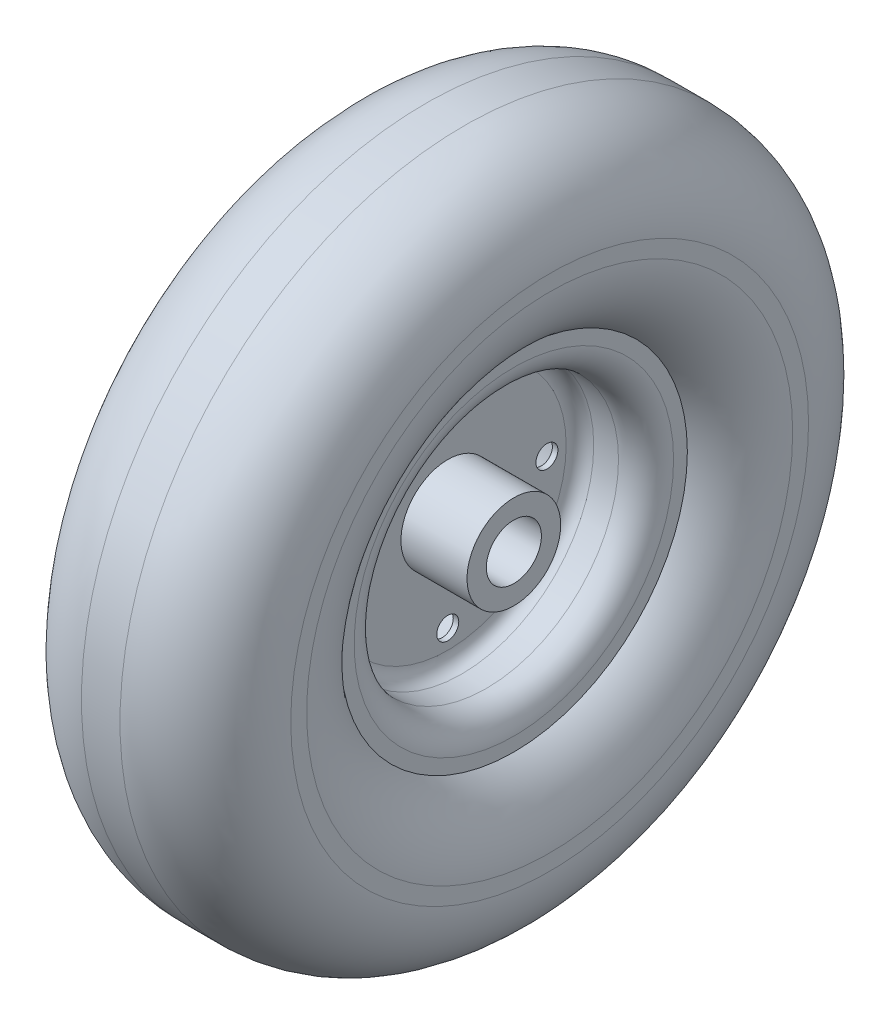
ISO-10303-21;
HEADER;
FILE_DESCRIPTION(('STEP AP214'),'2;1');
FILE_NAME('part.step','',(''),(''),'','','');
FILE_SCHEMA(('AUTOMOTIVE_DESIGN { 1 0 10303 214 1 1 1 1 }'));
ENDSEC;
DATA;
#1=APPLICATION_CONTEXT('core data for automotive mechanical design processes');
#2=APPLICATION_PROTOCOL_DEFINITION('international standard','automotive_design',2000,#1);
#3=PRODUCT_CONTEXT('',#1,'mechanical');
#4=PRODUCT('Part','Part','',(#3));
#5=PRODUCT_RELATED_PRODUCT_CATEGORY('part','',(#4));
#6=PRODUCT_DEFINITION_FORMATION('','',#4);
#7=PRODUCT_DEFINITION_CONTEXT('part definition',#1,'design');
#8=PRODUCT_DEFINITION('design','',#6,#7);
#9=PRODUCT_DEFINITION_SHAPE('','',#8);
#10=(LENGTH_UNIT() NAMED_UNIT(*) SI_UNIT(.MILLI.,.METRE.));
#11=(NAMED_UNIT(*) PLANE_ANGLE_UNIT() SI_UNIT($,.RADIAN.));
#12=(NAMED_UNIT(*) SI_UNIT($,.STERADIAN.) SOLID_ANGLE_UNIT());
#13=UNCERTAINTY_MEASURE_WITH_UNIT(LENGTH_MEASURE(1.E-05),#10,'distance_accuracy_value','');
#14=(GEOMETRIC_REPRESENTATION_CONTEXT(3) GLOBAL_UNCERTAINTY_ASSIGNED_CONTEXT((#13)) GLOBAL_UNIT_ASSIGNED_CONTEXT((#10,
#11,#12)) REPRESENTATION_CONTEXT('',''));
#15=CARTESIAN_POINT('',(0.,0.,0.));
#16=DIRECTION('',(0.,0.,1.));
#17=DIRECTION('',(1.,0.,0.));
#18=AXIS2_PLACEMENT_3D('',#15,#16,#17);
#19=CARTESIAN_POINT('',(76.,0.,0.));
#20=DIRECTION('',(-1.,0.,0.));
#21=DIRECTION('',(0.,0.,1.));
#22=AXIS2_PLACEMENT_3D('',#19,#20,#21);
#23=CYLINDRICAL_SURFACE('',#22,10.);
#24=CARTESIAN_POINT('',(13.,0.,0.));
#25=DIRECTION('',(-1.,0.,0.));
#26=DIRECTION('',(0.,0.,1.));
#27=AXIS2_PLACEMENT_3D('',#24,#25,#26);
#28=CIRCLE('',#27,10.);
#29=CARTESIAN_POINT('',(13.,0.,10.));
#30=VERTEX_POINT('',#29);
#31=EDGE_CURVE('E89',#30,#30,#28,.T.);
#32=ORIENTED_EDGE('',*,*,#31,.T.);
#33=EDGE_LOOP('',(#32));
#34=FACE_BOUND('',#33,.T.);
#35=CARTESIAN_POINT('',(63.,0.,0.));
#36=DIRECTION('',(1.,0.,0.));
#37=DIRECTION('',(0.,0.,-1.));
#38=AXIS2_PLACEMENT_3D('',#35,#36,#37);
#39=CIRCLE('',#38,10.);
#40=CARTESIAN_POINT('',(63.,0.,-10.));
#41=VERTEX_POINT('',#40);
#42=EDGE_CURVE('E84',#41,#41,#39,.T.);
#43=ORIENTED_EDGE('',*,*,#42,.T.);
#44=EDGE_LOOP('',(#43));
#45=FACE_BOUND('',#44,.T.);
#46=ADVANCED_FACE('F30',(#34,#45),#23,.F.);
#47=CARTESIAN_POINT('',(76.,0.,0.));
#48=DIRECTION('',(1.,0.,0.));
#49=DIRECTION('',(0.,0.,-1.));
#50=AXIS2_PLACEMENT_3D('',#47,#48,#49);
#51=PLANE('',#50);
#52=CARTESIAN_POINT('',(76.,0.,0.));
#53=DIRECTION('',(1.,0.,0.));
#54=DIRECTION('',(0.,0.,-1.));
#55=AXIS2_PLACEMENT_3D('',#52,#53,#54);
#56=CIRCLE('',#55,88.2388589282479);
#57=CARTESIAN_POINT('',(76.,0.,-88.2388589282479));
#58=VERTEX_POINT('',#57);
#59=EDGE_CURVE('E74',#58,#58,#56,.F.);
#60=ORIENTED_EDGE('',*,*,#59,.T.);
#61=EDGE_LOOP('',(#60));
#62=FACE_BOUND('',#61,.T.);
#63=CARTESIAN_POINT('',(76.,0.,0.));
#64=DIRECTION('',(1.,0.,0.));
#65=DIRECTION('',(0.,0.,-1.));
#66=AXIS2_PLACEMENT_3D('',#63,#64,#65);
#67=CIRCLE('',#66,94.);
#68=CARTESIAN_POINT('',(76.,0.,-94.));
#69=VERTEX_POINT('',#68);
#70=EDGE_CURVE('E77',#69,#69,#67,.T.);
#71=ORIENTED_EDGE('',*,*,#70,.T.);
#72=EDGE_LOOP('',(#71));
#73=FACE_BOUND('',#72,.T.);
#74=ADVANCED_FACE('F170',(#62,#73),#51,.T.);
#75=CARTESIAN_POINT('',(0.,0.,0.));
#76=DIRECTION('',(1.,0.,0.));
#77=DIRECTION('',(0.,0.,-1.));
#78=AXIS2_PLACEMENT_3D('',#75,#76,#77);
#79=PLANE('',#78);
#80=CARTESIAN_POINT('',(0.,0.,0.));
#81=DIRECTION('',(1.,0.,0.));
#82=DIRECTION('',(0.,0.,-1.));
#83=AXIS2_PLACEMENT_3D('',#80,#81,#82);
#84=CIRCLE('',#83,88.2388589282479);
#85=CARTESIAN_POINT('',(0.,0.,-88.2388589282479));
#86=VERTEX_POINT('',#85);
#87=EDGE_CURVE('E65',#86,#86,#84,.T.);
#88=ORIENTED_EDGE('',*,*,#87,.T.);
#89=EDGE_LOOP('',(#88));
#90=FACE_BOUND('',#89,.T.);
#91=CARTESIAN_POINT('',(0.,0.,0.));
#92=DIRECTION('',(1.,0.,0.));
#93=DIRECTION('',(0.,0.,-1.));
#94=AXIS2_PLACEMENT_3D('',#91,#92,#93);
#95=CIRCLE('',#94,94.);
#96=CARTESIAN_POINT('',(0.,0.,-94.));
#97=VERTEX_POINT('',#96);
#98=EDGE_CURVE('E68',#97,#97,#95,.F.);
#99=ORIENTED_EDGE('',*,*,#98,.T.);
#100=EDGE_LOOP('',(#99));
#101=FACE_BOUND('',#100,.T.);
#102=ADVANCED_FACE('F176',(#90,#101),#79,.F.);
#103=CARTESIAN_POINT('',(76.,0.,0.));
#104=DIRECTION('',(-1.,0.,0.));
#105=DIRECTION('',(0.,0.,1.));
#106=AXIS2_PLACEMENT_3D('',#103,#104,#105);
#107=CYLINDRICAL_SURFACE('',#106,125.);
#108=CARTESIAN_POINT('',(31.,0.,0.));
#109=DIRECTION('',(1.,0.,0.));
#110=DIRECTION('',(0.,0.,-1.));
#111=AXIS2_PLACEMENT_3D('',#108,#109,#110);
#112=CIRCLE('',#111,125.);
#113=CARTESIAN_POINT('',(31.,0.,-125.));
#114=VERTEX_POINT('',#113);
#115=EDGE_CURVE('E62',#114,#114,#112,.T.);
#116=ORIENTED_EDGE('',*,*,#115,.T.);
#117=EDGE_LOOP('',(#116));
#118=FACE_BOUND('',#117,.T.);
#119=CARTESIAN_POINT('',(45.,0.,0.));
#120=DIRECTION('',(1.,0.,0.));
#121=DIRECTION('',(0.,0.,-1.));
#122=AXIS2_PLACEMENT_3D('',#119,#120,#121);
#123=CIRCLE('',#122,125.);
#124=CARTESIAN_POINT('',(45.,0.,-125.));
#125=VERTEX_POINT('',#124);
#126=EDGE_CURVE('E71',#125,#125,#123,.F.);
#127=ORIENTED_EDGE('',*,*,#126,.T.);
#128=EDGE_LOOP('',(#127));
#129=FACE_BOUND('',#128,.T.);
#130=ADVANCED_FACE('F184',(#118,#129),#107,.T.);
#131=CARTESIAN_POINT('',(13.,0.,0.));
#132=DIRECTION('',(-1.,0.,0.));
#133=DIRECTION('',(0.,0.,1.));
#134=AXIS2_PLACEMENT_3D('',#131,#132,#133);
#135=PLANE('',#134);
#136=ORIENTED_EDGE('',*,*,#31,.F.);
#137=EDGE_LOOP('',(#136));
#138=FACE_BOUND('',#137,.T.);
#139=CARTESIAN_POINT('',(13.,0.,0.));
#140=DIRECTION('',(-1.,0.,0.));
#141=DIRECTION('',(0.,0.,1.));
#142=AXIS2_PLACEMENT_3D('',#139,#140,#141);
#143=CIRCLE('',#142,17.);
#144=CARTESIAN_POINT('',(13.,0.,17.));
#145=VERTEX_POINT('',#144);
#146=EDGE_CURVE('E86',#145,#145,#143,.F.);
#147=ORIENTED_EDGE('',*,*,#146,.F.);
#148=EDGE_LOOP('',(#147));
#149=FACE_BOUND('',#148,.T.);
#150=ADVANCED_FACE('F188',(#138,#149),#135,.T.);
#151=CARTESIAN_POINT('',(13.,0.,0.));
#152=DIRECTION('',(-1.,0.,0.));
#153=DIRECTION('',(0.,0.,1.));
#154=AXIS2_PLACEMENT_3D('',#151,#152,#153);
#155=CIRCLE('',#154,58.);
#156=CARTESIAN_POINT('',(13.,0.,58.));
#157=VERTEX_POINT('',#156);
#158=EDGE_CURVE('E59',#157,#157,#155,.F.);
#159=ORIENTED_EDGE('',*,*,#158,.T.);
#160=EDGE_LOOP('',(#159));
#161=FACE_BOUND('',#160,.T.);
#162=CARTESIAN_POINT('',(13.,0.,0.));
#163=DIRECTION('',(-1.,0.,0.));
#164=DIRECTION('',(0.,0.,1.));
#165=AXIS2_PLACEMENT_3D('',#162,#163,#164);
#166=CIRCLE('',#165,63.);
#167=CARTESIAN_POINT('',(13.,0.,63.));
#168=VERTEX_POINT('',#167);
#169=EDGE_CURVE('E90',#168,#168,#166,.T.);
#170=ORIENTED_EDGE('',*,*,#169,.T.);
#171=EDGE_LOOP('',(#170));
#172=FACE_BOUND('',#171,.T.);
#173=ADVANCED_FACE('F312',(#161,#172),#135,.T.);
#174=CARTESIAN_POINT('',(37.,0.,0.));
#175=DIRECTION('',(-1.,0.,0.));
#176=DIRECTION('',(0.,0.,1.));
#177=AXIS2_PLACEMENT_3D('',#174,#175,#176);
#178=CYLINDRICAL_SURFACE('',#177,48.);
#179=CARTESIAN_POINT('',(32.,0.,0.));
#180=DIRECTION('',(-1.,0.,0.));
#181=DIRECTION('',(0.,0.,1.));
#182=AXIS2_PLACEMENT_3D('',#179,#180,#181);
#183=CIRCLE('',#182,48.);
#184=CARTESIAN_POINT('',(32.,0.,48.));
#185=VERTEX_POINT('',#184);
#186=EDGE_CURVE('E10',#185,#185,#183,.F.);
#187=ORIENTED_EDGE('',*,*,#186,.T.);
#188=EDGE_LOOP('',(#187));
#189=FACE_BOUND('',#188,.T.);
#190=CARTESIAN_POINT('',(23.,0.,0.));
#191=DIRECTION('',(-1.,0.,0.));
#192=DIRECTION('',(0.,0.,1.));
#193=AXIS2_PLACEMENT_3D('',#190,#191,#192);
#194=CIRCLE('',#193,48.);
#195=CARTESIAN_POINT('',(23.,0.,48.));
#196=VERTEX_POINT('',#195);
#197=EDGE_CURVE('E56',#196,#196,#194,.T.);
#198=ORIENTED_EDGE('',*,*,#197,.T.);
#199=EDGE_LOOP('',(#198));
#200=FACE_BOUND('',#199,.T.);
#201=ADVANCED_FACE('F308',(#189,#200),#178,.F.);
#202=CARTESIAN_POINT('',(37.,0.,0.));
#203=DIRECTION('',(-1.,0.,0.));
#204=DIRECTION('',(0.,0.,1.));
#205=AXIS2_PLACEMENT_3D('',#202,#203,#204);
#206=PLANE('',#205);
#207=CARTESIAN_POINT('',(37.,0.,0.));
#208=DIRECTION('',(-1.,0.,0.));
#209=DIRECTION('',(0.,0.,1.));
#210=AXIS2_PLACEMENT_3D('',#207,#208,#209);
#211=CIRCLE('',#210,43.);
#212=CARTESIAN_POINT('',(37.,0.,43.));
#213=VERTEX_POINT('',#212);
#214=EDGE_CURVE('E37',#213,#213,#211,.T.);
#215=ORIENTED_EDGE('',*,*,#214,.T.);
#216=EDGE_LOOP('',(#215));
#217=FACE_BOUND('',#216,.T.);
#218=CARTESIAN_POINT('',(37.,-1.0231817578993E-12,35.999999999999));
#219=DIRECTION('',(-1.,0.,0.));
#220=DIRECTION('',(0.,0.,1.));
#221=AXIS2_PLACEMENT_3D('',#218,#219,#220);
#222=CIRCLE('',#221,4.00000000000164);
#223=CARTESIAN_POINT('',(37.,-1.0231817578993E-12,40.0000000000006));
#224=VERTEX_POINT('',#223);
#225=EDGE_CURVE('E122',#224,#224,#222,.T.);
#226=ORIENTED_EDGE('',*,*,#225,.F.);
#227=EDGE_LOOP('',(#226));
#228=FACE_BOUND('',#227,.T.);
#229=CARTESIAN_POINT('',(37.,-36.,-2.03754605884474E-12));
#230=DIRECTION('',(-1.,0.,0.));
#231=DIRECTION('',(0.,0.,1.));
#232=AXIS2_PLACEMENT_3D('',#229,#230,#231);
#233=CIRCLE('',#232,4.00000000000219);
#234=CARTESIAN_POINT('',(37.,-36.,4.00000000000015));
#235=VERTEX_POINT('',#234);
#236=EDGE_CURVE('E116',#235,#235,#233,.T.);
#237=ORIENTED_EDGE('',*,*,#236,.F.);
#238=EDGE_LOOP('',(#237));
#239=FACE_BOUND('',#238,.T.);
#240=CARTESIAN_POINT('',(37.,1.01877302942237E-12,-36.000000000001));
#241=DIRECTION('',(-1.,0.,0.));
#242=DIRECTION('',(0.,0.,1.));
#243=AXIS2_PLACEMENT_3D('',#240,#241,#242);
#244=CIRCLE('',#243,4.0000000000008);
#245=CARTESIAN_POINT('',(37.,1.01877302942237E-12,-32.0000000000002));
#246=VERTEX_POINT('',#245);
#247=EDGE_CURVE('E110',#246,#246,#244,.T.);
#248=ORIENTED_EDGE('',*,*,#247,.F.);
#249=EDGE_LOOP('',(#248));
#250=FACE_BOUND('',#249,.T.);
#251=CARTESIAN_POINT('',(37.,36.,0.));
#252=DIRECTION('',(-1.,0.,0.));
#253=DIRECTION('',(0.,0.,1.));
#254=AXIS2_PLACEMENT_3D('',#251,#252,#253);
#255=CIRCLE('',#254,4.);
#256=CARTESIAN_POINT('',(37.,36.,4.));
#257=VERTEX_POINT('',#256);
#258=EDGE_CURVE('E104',#257,#257,#255,.T.);
#259=ORIENTED_EDGE('',*,*,#258,.F.);
#260=EDGE_LOOP('',(#259));
#261=FACE_BOUND('',#260,.T.);
#262=CARTESIAN_POINT('',(37.,0.,0.));
#263=DIRECTION('',(-1.,0.,0.));
#264=DIRECTION('',(0.,0.,1.));
#265=AXIS2_PLACEMENT_3D('',#262,#263,#264);
#266=CIRCLE('',#265,17.);
#267=CARTESIAN_POINT('',(37.,0.,17.));
#268=VERTEX_POINT('',#267);
#269=EDGE_CURVE('E93',#268,#268,#266,.T.);
#270=ORIENTED_EDGE('',*,*,#269,.F.);
#271=EDGE_LOOP('',(#270));
#272=FACE_BOUND('',#271,.T.);
#273=ADVANCED_FACE('F163',(#217,#228,#239,#250,#261,#272),#206,.T.);
#274=CARTESIAN_POINT('',(37.,0.,0.));
#275=DIRECTION('',(-1.,0.,0.));
#276=DIRECTION('',(0.,0.,1.));
#277=AXIS2_PLACEMENT_3D('',#274,#275,#276);
#278=CYLINDRICAL_SURFACE('',#277,17.);
#279=ORIENTED_EDGE('',*,*,#269,.T.);
#280=EDGE_LOOP('',(#279));
#281=FACE_BOUND('',#280,.T.);
#282=ORIENTED_EDGE('',*,*,#146,.T.);
#283=EDGE_LOOP('',(#282));
#284=FACE_BOUND('',#283,.T.);
#285=ADVANCED_FACE('F155',(#281,#284),#278,.T.);
#286=CARTESIAN_POINT('',(63.,0.,0.));
#287=DIRECTION('',(1.,0.,0.));
#288=DIRECTION('',(0.,0.,-1.));
#289=AXIS2_PLACEMENT_3D('',#286,#287,#288);
#290=PLANE('',#289);
#291=ORIENTED_EDGE('',*,*,#42,.F.);
#292=EDGE_LOOP('',(#291));
#293=FACE_BOUND('',#292,.T.);
#294=CARTESIAN_POINT('',(63.,0.,0.));
#295=DIRECTION('',(1.,0.,0.));
#296=DIRECTION('',(0.,0.,-1.));
#297=AXIS2_PLACEMENT_3D('',#294,#295,#296);
#298=CIRCLE('',#297,17.);
#299=CARTESIAN_POINT('',(63.,0.,-17.));
#300=VERTEX_POINT('',#299);
#301=EDGE_CURVE('E81',#300,#300,#298,.F.);
#302=ORIENTED_EDGE('',*,*,#301,.F.);
#303=EDGE_LOOP('',(#302));
#304=FACE_BOUND('',#303,.T.);
#305=ADVANCED_FACE('F152',(#293,#304),#290,.T.);
#306=CARTESIAN_POINT('',(63.,0.,0.));
#307=DIRECTION('',(1.,0.,0.));
#308=DIRECTION('',(0.,0.,-1.));
#309=AXIS2_PLACEMENT_3D('',#306,#307,#308);
#310=CIRCLE('',#309,58.);
#311=CARTESIAN_POINT('',(63.,0.,-58.));
#312=VERTEX_POINT('',#311);
#313=EDGE_CURVE('E53',#312,#312,#310,.F.);
#314=ORIENTED_EDGE('',*,*,#313,.T.);
#315=EDGE_LOOP('',(#314));
#316=FACE_BOUND('',#315,.T.);
#317=CARTESIAN_POINT('',(63.,0.,0.));
#318=DIRECTION('',(1.,0.,0.));
#319=DIRECTION('',(0.,0.,-1.));
#320=AXIS2_PLACEMENT_3D('',#317,#318,#319);
#321=CIRCLE('',#320,63.);
#322=CARTESIAN_POINT('',(63.,0.,-63.));
#323=VERTEX_POINT('',#322);
#324=EDGE_CURVE('E85',#323,#323,#321,.T.);
#325=ORIENTED_EDGE('',*,*,#324,.T.);
#326=EDGE_LOOP('',(#325));
#327=FACE_BOUND('',#326,.T.);
#328=ADVANCED_FACE('F154',(#316,#327),#290,.T.);
#329=CARTESIAN_POINT('',(39.,0.,0.));
#330=DIRECTION('',(1.,0.,0.));
#331=DIRECTION('',(0.,0.,-1.));
#332=AXIS2_PLACEMENT_3D('',#329,#330,#331);
#333=CYLINDRICAL_SURFACE('',#332,48.);
#334=CARTESIAN_POINT('',(44.,0.,0.));
#335=DIRECTION('',(1.,0.,0.));
#336=DIRECTION('',(0.,0.,-1.));
#337=AXIS2_PLACEMENT_3D('',#334,#335,#336);
#338=CIRCLE('',#337,48.);
#339=CARTESIAN_POINT('',(44.,0.,-48.));
#340=VERTEX_POINT('',#339);
#341=EDGE_CURVE('E41',#340,#340,#338,.F.);
#342=ORIENTED_EDGE('',*,*,#341,.T.);
#343=EDGE_LOOP('',(#342));
#344=FACE_BOUND('',#343,.T.);
#345=CARTESIAN_POINT('',(53.,0.,0.));
#346=DIRECTION('',(1.,0.,0.));
#347=DIRECTION('',(0.,0.,-1.));
#348=AXIS2_PLACEMENT_3D('',#345,#346,#347);
#349=CIRCLE('',#348,48.);
#350=CARTESIAN_POINT('',(53.,0.,-48.));
#351=VERTEX_POINT('',#350);
#352=EDGE_CURVE('E50',#351,#351,#349,.T.);
#353=ORIENTED_EDGE('',*,*,#352,.T.);
#354=EDGE_LOOP('',(#353));
#355=FACE_BOUND('',#354,.T.);
#356=ADVANCED_FACE('F135',(#344,#355),#333,.F.);
#357=CARTESIAN_POINT('',(39.,0.,0.));
#358=DIRECTION('',(1.,0.,0.));
#359=DIRECTION('',(0.,0.,-1.));
#360=AXIS2_PLACEMENT_3D('',#357,#358,#359);
#361=PLANE('',#360);
#362=CARTESIAN_POINT('',(39.,0.,0.));
#363=DIRECTION('',(1.,0.,0.));
#364=DIRECTION('',(0.,0.,-1.));
#365=AXIS2_PLACEMENT_3D('',#362,#363,#364);
#366=CIRCLE('',#365,43.);
#367=CARTESIAN_POINT('',(39.,0.,-43.));
#368=VERTEX_POINT('',#367);
#369=EDGE_CURVE('E45',#368,#368,#366,.T.);
#370=ORIENTED_EDGE('',*,*,#369,.T.);
#371=EDGE_LOOP('',(#370));
#372=FACE_BOUND('',#371,.T.);
#373=CARTESIAN_POINT('',(39.,-1.0231817578993E-12,35.999999999999));
#374=DIRECTION('',(1.,0.,0.));
#375=DIRECTION('',(0.,0.,-1.));
#376=AXIS2_PLACEMENT_3D('',#373,#374,#375);
#377=CIRCLE('',#376,4.00000000000164);
#378=CARTESIAN_POINT('',(39.,-1.0231817578993E-12,31.9999999999973));
#379=VERTEX_POINT('',#378);
#380=EDGE_CURVE('E125',#379,#379,#377,.T.);
#381=ORIENTED_EDGE('',*,*,#380,.F.);
#382=EDGE_LOOP('',(#381));
#383=FACE_BOUND('',#382,.T.);
#384=CARTESIAN_POINT('',(39.,-36.,-2.03754605884474E-12));
#385=DIRECTION('',(1.,0.,0.));
#386=DIRECTION('',(0.,0.,-1.));
#387=AXIS2_PLACEMENT_3D('',#384,#385,#386);
#388=CIRCLE('',#387,4.00000000000219);
#389=CARTESIAN_POINT('',(39.,-36.,-4.00000000000423));
#390=VERTEX_POINT('',#389);
#391=EDGE_CURVE('E119',#390,#390,#388,.T.);
#392=ORIENTED_EDGE('',*,*,#391,.F.);
#393=EDGE_LOOP('',(#392));
#394=FACE_BOUND('',#393,.T.);
#395=CARTESIAN_POINT('',(39.,1.01877302942237E-12,-36.000000000001));
#396=DIRECTION('',(1.,0.,0.));
#397=DIRECTION('',(0.,0.,-1.));
#398=AXIS2_PLACEMENT_3D('',#395,#396,#397);
#399=CIRCLE('',#398,4.0000000000008);
#400=CARTESIAN_POINT('',(39.,1.01877302942237E-12,-40.0000000000018));
#401=VERTEX_POINT('',#400);
#402=EDGE_CURVE('E113',#401,#401,#399,.T.);
#403=ORIENTED_EDGE('',*,*,#402,.F.);
#404=EDGE_LOOP('',(#403));
#405=FACE_BOUND('',#404,.T.);
#406=CARTESIAN_POINT('',(39.,36.,0.));
#407=DIRECTION('',(1.,0.,0.));
#408=DIRECTION('',(0.,0.,-1.));
#409=AXIS2_PLACEMENT_3D('',#406,#407,#408);
#410=CIRCLE('',#409,4.);
#411=CARTESIAN_POINT('',(39.,36.,-4.));
#412=VERTEX_POINT('',#411);
#413=EDGE_CURVE('E107',#412,#412,#410,.T.);
#414=ORIENTED_EDGE('',*,*,#413,.F.);
#415=EDGE_LOOP('',(#414));
#416=FACE_BOUND('',#415,.T.);
#417=CARTESIAN_POINT('',(39.,0.,0.));
#418=DIRECTION('',(1.,0.,0.));
#419=DIRECTION('',(0.,0.,-1.));
#420=AXIS2_PLACEMENT_3D('',#417,#418,#419);
#421=CIRCLE('',#420,17.);
#422=CARTESIAN_POINT('',(39.,0.,-17.));
#423=VERTEX_POINT('',#422);
#424=EDGE_CURVE('E80',#423,#423,#421,.T.);
#425=ORIENTED_EDGE('',*,*,#424,.F.);
#426=EDGE_LOOP('',(#425));
#427=FACE_BOUND('',#426,.T.);
#428=ADVANCED_FACE('F131',(#372,#383,#394,#405,#416,#427),#361,.T.);
#429=CARTESIAN_POINT('',(39.,0.,0.));
#430=DIRECTION('',(1.,0.,0.));
#431=DIRECTION('',(0.,0.,-1.));
#432=AXIS2_PLACEMENT_3D('',#429,#430,#431);
#433=CYLINDRICAL_SURFACE('',#432,17.);
#434=ORIENTED_EDGE('',*,*,#424,.T.);
#435=EDGE_LOOP('',(#434));
#436=FACE_BOUND('',#435,.T.);
#437=ORIENTED_EDGE('',*,*,#301,.T.);
#438=EDGE_LOOP('',(#437));
#439=FACE_BOUND('',#438,.T.);
#440=ADVANCED_FACE('F134',(#436,#439),#433,.T.);
#441=CARTESIAN_POINT('',(0.,36.,0.));
#442=DIRECTION('',(1.,0.,0.));
#443=DIRECTION('',(0.,0.,-1.));
#444=AXIS2_PLACEMENT_3D('',#441,#442,#443);
#445=CYLINDRICAL_SURFACE('',#444,4.);
#446=ORIENTED_EDGE('',*,*,#258,.T.);
#447=EDGE_LOOP('',(#446));
#448=FACE_BOUND('',#447,.T.);
#449=ORIENTED_EDGE('',*,*,#413,.T.);
#450=EDGE_LOOP('',(#449));
#451=FACE_BOUND('',#450,.T.);
#452=ADVANCED_FACE('F148',(#448,#451),#445,.F.);
#453=CARTESIAN_POINT('',(0.,1.01877302942237E-12,-36.000000000001));
#454=DIRECTION('',(1.,0.,0.));
#455=DIRECTION('',(0.,0.,-1.));
#456=AXIS2_PLACEMENT_3D('',#453,#454,#455);
#457=CYLINDRICAL_SURFACE('',#456,4.0000000000008);
#458=ORIENTED_EDGE('',*,*,#247,.T.);
#459=EDGE_LOOP('',(#458));
#460=FACE_BOUND('',#459,.T.);
#461=ORIENTED_EDGE('',*,*,#402,.T.);
#462=EDGE_LOOP('',(#461));
#463=FACE_BOUND('',#462,.T.);
#464=ADVANCED_FACE('F251',(#460,#463),#457,.F.);
#465=CARTESIAN_POINT('',(0.,-36.,-2.03754605884474E-12));
#466=DIRECTION('',(1.,0.,0.));
#467=DIRECTION('',(0.,0.,-1.));
#468=AXIS2_PLACEMENT_3D('',#465,#466,#467);
#469=CYLINDRICAL_SURFACE('',#468,4.00000000000219);
#470=ORIENTED_EDGE('',*,*,#236,.T.);
#471=EDGE_LOOP('',(#470));
#472=FACE_BOUND('',#471,.T.);
#473=ORIENTED_EDGE('',*,*,#391,.T.);
#474=EDGE_LOOP('',(#473));
#475=FACE_BOUND('',#474,.T.);
#476=ADVANCED_FACE('F258',(#472,#475),#469,.F.);
#477=CARTESIAN_POINT('',(0.,-1.0231817578993E-12,35.999999999999));
#478=DIRECTION('',(1.,0.,0.));
#479=DIRECTION('',(0.,0.,-1.));
#480=AXIS2_PLACEMENT_3D('',#477,#478,#479);
#481=CYLINDRICAL_SURFACE('',#480,4.00000000000164);
#482=ORIENTED_EDGE('',*,*,#225,.T.);
#483=EDGE_LOOP('',(#482));
#484=FACE_BOUND('',#483,.T.);
#485=ORIENTED_EDGE('',*,*,#380,.T.);
#486=EDGE_LOOP('',(#485));
#487=FACE_BOUND('',#486,.T.);
#488=ADVANCED_FACE('F129',(#484,#487),#481,.F.);
#489=CARTESIAN_POINT('',(45.,0.,0.));
#490=DIRECTION('',(1.,0.,0.));
#491=DIRECTION('',(0.,0.,-1.));
#492=AXIS2_PLACEMENT_3D('',#489,#490,#491);
#493=TOROIDAL_SURFACE('',#492,88.2388589282479,31.);
#494=ORIENTED_EDGE('',*,*,#59,.F.);
#495=EDGE_LOOP('',(#494));
#496=FACE_BOUND('',#495,.T.);
#497=ORIENTED_EDGE('',*,*,#324,.F.);
#498=EDGE_LOOP('',(#497));
#499=FACE_BOUND('',#498,.T.);
#500=ADVANCED_FACE('F190',(#496,#499),#493,.T.);
#501=CARTESIAN_POINT('',(45.,0.,0.));
#502=DIRECTION('',(1.,0.,0.));
#503=DIRECTION('',(0.,0.,-1.));
#504=AXIS2_PLACEMENT_3D('',#501,#502,#503);
#505=TOROIDAL_SURFACE('',#504,94.,31.);
#506=ORIENTED_EDGE('',*,*,#126,.F.);
#507=EDGE_LOOP('',(#506));
#508=FACE_BOUND('',#507,.T.);
#509=ORIENTED_EDGE('',*,*,#70,.F.);
#510=EDGE_LOOP('',(#509));
#511=FACE_BOUND('',#510,.T.);
#512=ADVANCED_FACE('F193',(#508,#511),#505,.T.);
#513=CARTESIAN_POINT('',(31.,0.,0.));
#514=DIRECTION('',(1.,0.,0.));
#515=DIRECTION('',(0.,0.,-1.));
#516=AXIS2_PLACEMENT_3D('',#513,#514,#515);
#517=TOROIDAL_SURFACE('',#516,88.2388589282479,31.);
#518=ORIENTED_EDGE('',*,*,#87,.F.);
#519=EDGE_LOOP('',(#518));
#520=FACE_BOUND('',#519,.T.);
#521=ORIENTED_EDGE('',*,*,#169,.F.);
#522=EDGE_LOOP('',(#521));
#523=FACE_BOUND('',#522,.T.);
#524=ADVANCED_FACE('F197',(#520,#523),#517,.T.);
#525=CARTESIAN_POINT('',(31.,0.,0.));
#526=DIRECTION('',(1.,0.,0.));
#527=DIRECTION('',(0.,0.,-1.));
#528=AXIS2_PLACEMENT_3D('',#525,#526,#527);
#529=TOROIDAL_SURFACE('',#528,94.,31.);
#530=ORIENTED_EDGE('',*,*,#98,.F.);
#531=EDGE_LOOP('',(#530));
#532=FACE_BOUND('',#531,.T.);
#533=ORIENTED_EDGE('',*,*,#115,.F.);
#534=EDGE_LOOP('',(#533));
#535=FACE_BOUND('',#534,.T.);
#536=ADVANCED_FACE('F201',(#532,#535),#529,.T.);
#537=CARTESIAN_POINT('',(23.,0.,0.));
#538=DIRECTION('',(-1.,0.,0.));
#539=DIRECTION('',(0.,0.,1.));
#540=AXIS2_PLACEMENT_3D('',#537,#538,#539);
#541=TOROIDAL_SURFACE('',#540,58.,10.);
#542=ORIENTED_EDGE('',*,*,#197,.F.);
#543=EDGE_LOOP('',(#542));
#544=FACE_BOUND('',#543,.T.);
#545=ORIENTED_EDGE('',*,*,#158,.F.);
#546=EDGE_LOOP('',(#545));
#547=FACE_BOUND('',#546,.T.);
#548=ADVANCED_FACE('F205',(#544,#547),#541,.T.);
#549=CARTESIAN_POINT('',(53.,0.,0.));
#550=DIRECTION('',(1.,0.,0.));
#551=DIRECTION('',(0.,0.,-1.));
#552=AXIS2_PLACEMENT_3D('',#549,#550,#551);
#553=TOROIDAL_SURFACE('',#552,58.,10.);
#554=ORIENTED_EDGE('',*,*,#352,.F.);
#555=EDGE_LOOP('',(#554));
#556=FACE_BOUND('',#555,.T.);
#557=ORIENTED_EDGE('',*,*,#313,.F.);
#558=EDGE_LOOP('',(#557));
#559=FACE_BOUND('',#558,.T.);
#560=ADVANCED_FACE('F209',(#556,#559),#553,.T.);
#561=CARTESIAN_POINT('',(44.,0.,0.));
#562=DIRECTION('',(1.,0.,0.));
#563=DIRECTION('',(0.,0.,-1.));
#564=AXIS2_PLACEMENT_3D('',#561,#562,#563);
#565=TOROIDAL_SURFACE('',#564,43.,5.);
#566=ORIENTED_EDGE('',*,*,#341,.F.);
#567=EDGE_LOOP('',(#566));
#568=FACE_BOUND('',#567,.T.);
#569=ORIENTED_EDGE('',*,*,#369,.F.);
#570=EDGE_LOOP('',(#569));
#571=FACE_BOUND('',#570,.T.);
#572=ADVANCED_FACE('F212',(#568,#571),#565,.F.);
#573=CARTESIAN_POINT('',(32.,0.,0.));
#574=DIRECTION('',(-1.,0.,0.));
#575=DIRECTION('',(0.,0.,1.));
#576=AXIS2_PLACEMENT_3D('',#573,#574,#575);
#577=TOROIDAL_SURFACE('',#576,43.,5.);
#578=ORIENTED_EDGE('',*,*,#186,.F.);
#579=EDGE_LOOP('',(#578));
#580=FACE_BOUND('',#579,.T.);
#581=ORIENTED_EDGE('',*,*,#214,.F.);
#582=EDGE_LOOP('',(#581));
#583=FACE_BOUND('',#582,.T.);
#584=ADVANCED_FACE('F32',(#580,#583),#577,.F.);
#585=CLOSED_SHELL('',(#46,#74,#102,#130,#150,#173,#201,#273,#285,#305,#328,#356,#428,#440,#452,
#464,#476,#488,#500,#512,#524,#536,#548,#560,#572,#584));
#586=MANIFOLD_SOLID_BREP('B2',#585);
#587=ADVANCED_BREP_SHAPE_REPRESENTATION('',(#18,#586),#14);
#588=SHAPE_DEFINITION_REPRESENTATION(#9,#587);
ENDSEC;
END-ISO-10303-21;
